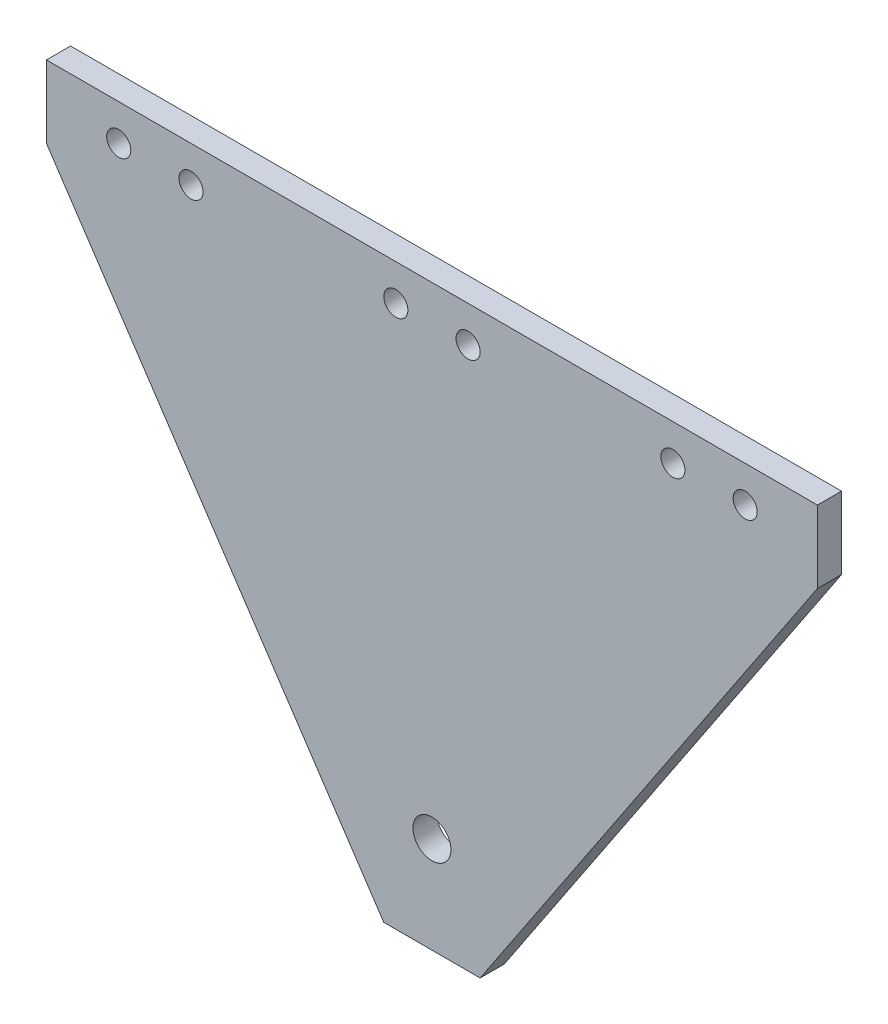
ISO-10303-21;
HEADER;
FILE_DESCRIPTION(('STEP AP214'),'2;1');
FILE_NAME('part.step','',(''),(''),'','','');
FILE_SCHEMA(('AUTOMOTIVE_DESIGN { 1 0 10303 214 1 1 1 1 }'));
ENDSEC;
DATA;
#1=APPLICATION_CONTEXT('core data for automotive mechanical design processes');
#2=APPLICATION_PROTOCOL_DEFINITION('international standard','automotive_design',2000,#1);
#3=PRODUCT_CONTEXT('',#1,'mechanical');
#4=PRODUCT('Part','Part','',(#3));
#5=PRODUCT_RELATED_PRODUCT_CATEGORY('part','',(#4));
#6=PRODUCT_DEFINITION_FORMATION('','',#4);
#7=PRODUCT_DEFINITION_CONTEXT('part definition',#1,'design');
#8=PRODUCT_DEFINITION('design','',#6,#7);
#9=PRODUCT_DEFINITION_SHAPE('','',#8);
#10=(LENGTH_UNIT() NAMED_UNIT(*) SI_UNIT(.MILLI.,.METRE.));
#11=(NAMED_UNIT(*) PLANE_ANGLE_UNIT() SI_UNIT($,.RADIAN.));
#12=(NAMED_UNIT(*) SI_UNIT($,.STERADIAN.) SOLID_ANGLE_UNIT());
#13=UNCERTAINTY_MEASURE_WITH_UNIT(LENGTH_MEASURE(1.E-05),#10,'distance_accuracy_value','');
#14=(GEOMETRIC_REPRESENTATION_CONTEXT(3) GLOBAL_UNCERTAINTY_ASSIGNED_CONTEXT((#13)) GLOBAL_UNIT_ASSIGNED_CONTEXT((#10,
#11,#12)) REPRESENTATION_CONTEXT('',''));
#15=CARTESIAN_POINT('',(0.,0.,0.));
#16=DIRECTION('',(0.,0.,1.));
#17=DIRECTION('',(1.,0.,0.));
#18=AXIS2_PLACEMENT_3D('',#15,#16,#17);
#19=CARTESIAN_POINT('',(0.,0.,3.175));
#20=DIRECTION('',(0.,0.,-1.));
#21=DIRECTION('',(-1.,0.,0.));
#22=AXIS2_PLACEMENT_3D('',#19,#20,#21);
#23=PLANE('',#22);
#24=DIRECTION('',(0.,1.,0.));
#25=VECTOR('',#24,1.);
#26=CARTESIAN_POINT('',(50.8,-4.7625,3.175));
#27=LINE('',#26,#25);
#28=CARTESIAN_POINT('',(50.8,-4.7625,3.175));
#29=VERTEX_POINT('',#28);
#30=CARTESIAN_POINT('',(50.8,4.7625,3.175));
#31=VERTEX_POINT('',#30);
#32=EDGE_CURVE('E129',#29,#31,#27,.T.);
#33=ORIENTED_EDGE('',*,*,#32,.T.);
#34=DIRECTION('',(-1.,0.,0.));
#35=VECTOR('',#34,1.);
#36=CARTESIAN_POINT('',(-50.8,4.7625,3.175));
#37=LINE('',#36,#35);
#38=CARTESIAN_POINT('',(-50.8,4.7625,3.175));
#39=VERTEX_POINT('',#38);
#40=EDGE_CURVE('E87',#31,#39,#37,.T.);
#41=ORIENTED_EDGE('',*,*,#40,.T.);
#42=DIRECTION('',(0.,-1.,0.));
#43=VECTOR('',#42,1.);
#44=CARTESIAN_POINT('',(-50.8,-4.7625,3.175));
#45=LINE('',#44,#43);
#46=CARTESIAN_POINT('',(-50.8,-4.7625,3.175));
#47=VERTEX_POINT('',#46);
#48=EDGE_CURVE('E100',#39,#47,#45,.T.);
#49=ORIENTED_EDGE('',*,*,#48,.T.);
#50=DIRECTION('',(0.554700196225229,-0.832050294337844,0.));
#51=VECTOR('',#50,1.);
#52=CARTESIAN_POINT('',(-50.8,-4.7625,3.175));
#53=LINE('',#52,#51);
#54=CARTESIAN_POINT('',(-6.34999999999999,-71.4375,3.175));
#55=VERTEX_POINT('',#54);
#56=EDGE_CURVE('E94',#47,#55,#53,.T.);
#57=ORIENTED_EDGE('',*,*,#56,.T.);
#58=DIRECTION('',(1.,0.,0.));
#59=VECTOR('',#58,1.);
#60=CARTESIAN_POINT('',(-6.34999999999999,-71.4375,3.175));
#61=LINE('',#60,#59);
#62=CARTESIAN_POINT('',(6.35000000000001,-71.4375,3.175));
#63=VERTEX_POINT('',#62);
#64=EDGE_CURVE('E98',#55,#63,#61,.T.);
#65=ORIENTED_EDGE('',*,*,#64,.T.);
#66=DIRECTION('',(0.554700196225229,0.832050294337844,0.));
#67=VECTOR('',#66,1.);
#68=CARTESIAN_POINT('',(50.8,-4.7625,3.175));
#69=LINE('',#68,#67);
#70=EDGE_CURVE('E50',#63,#29,#69,.T.);
#71=ORIENTED_EDGE('',*,*,#70,.T.);
#72=EDGE_LOOP('',(#33,#41,#49,#57,#65,#71));
#73=FACE_BOUND('',#72,.T.);
#74=CARTESIAN_POINT('',(0.,-58.7375,3.175));
#75=DIRECTION('',(0.,0.,1.));
#76=DIRECTION('',(1.,0.,0.));
#77=AXIS2_PLACEMENT_3D('',#74,#75,#76);
#78=CIRCLE('',#77,2.50000008);
#79=CARTESIAN_POINT('',(2.50000008000001,-58.7375,3.175));
#80=VERTEX_POINT('',#79);
#81=EDGE_CURVE('E122',#80,#80,#78,.T.);
#82=ORIENTED_EDGE('',*,*,#81,.F.);
#83=EDGE_LOOP('',(#82));
#84=FACE_BOUND('',#83,.T.);
#85=CARTESIAN_POINT('',(4.7625,0.,3.175));
#86=DIRECTION('',(0.,0.,1.));
#87=DIRECTION('',(1.,0.,0.));
#88=AXIS2_PLACEMENT_3D('',#85,#86,#87);
#89=CIRCLE('',#88,1.5875);
#90=CARTESIAN_POINT('',(6.35,0.,3.175));
#91=VERTEX_POINT('',#90);
#92=EDGE_CURVE('E223',#91,#91,#89,.T.);
#93=ORIENTED_EDGE('',*,*,#92,.F.);
#94=EDGE_LOOP('',(#93));
#95=FACE_BOUND('',#94,.T.);
#96=CARTESIAN_POINT('',(-4.7625,0.,3.175));
#97=DIRECTION('',(0.,0.,1.));
#98=DIRECTION('',(1.,0.,0.));
#99=AXIS2_PLACEMENT_3D('',#96,#97,#98);
#100=CIRCLE('',#99,1.5875);
#101=CARTESIAN_POINT('',(-3.175,0.,3.175));
#102=VERTEX_POINT('',#101);
#103=EDGE_CURVE('E217',#102,#102,#100,.T.);
#104=ORIENTED_EDGE('',*,*,#103,.F.);
#105=EDGE_LOOP('',(#104));
#106=FACE_BOUND('',#105,.T.);
#107=CARTESIAN_POINT('',(-41.275,0.,3.175));
#108=DIRECTION('',(0.,0.,1.));
#109=DIRECTION('',(1.,0.,0.));
#110=AXIS2_PLACEMENT_3D('',#107,#108,#109);
#111=CIRCLE('',#110,1.5875);
#112=CARTESIAN_POINT('',(-39.6875,0.,3.175));
#113=VERTEX_POINT('',#112);
#114=EDGE_CURVE('E211',#113,#113,#111,.T.);
#115=ORIENTED_EDGE('',*,*,#114,.F.);
#116=EDGE_LOOP('',(#115));
#117=FACE_BOUND('',#116,.T.);
#118=CARTESIAN_POINT('',(-31.75,0.,3.175));
#119=DIRECTION('',(0.,0.,1.));
#120=DIRECTION('',(1.,0.,0.));
#121=AXIS2_PLACEMENT_3D('',#118,#119,#120);
#122=CIRCLE('',#121,1.5875);
#123=CARTESIAN_POINT('',(-30.1625,0.,3.175));
#124=VERTEX_POINT('',#123);
#125=EDGE_CURVE('E205',#124,#124,#122,.T.);
#126=ORIENTED_EDGE('',*,*,#125,.F.);
#127=EDGE_LOOP('',(#126));
#128=FACE_BOUND('',#127,.T.);
#129=CARTESIAN_POINT('',(31.75,0.,3.175));
#130=DIRECTION('',(0.,0.,1.));
#131=DIRECTION('',(1.,0.,0.));
#132=AXIS2_PLACEMENT_3D('',#129,#130,#131);
#133=CIRCLE('',#132,1.5875);
#134=CARTESIAN_POINT('',(33.3375,0.,3.175));
#135=VERTEX_POINT('',#134);
#136=EDGE_CURVE('E199',#135,#135,#133,.T.);
#137=ORIENTED_EDGE('',*,*,#136,.F.);
#138=EDGE_LOOP('',(#137));
#139=FACE_BOUND('',#138,.T.);
#140=CARTESIAN_POINT('',(41.275,0.,3.175));
#141=DIRECTION('',(0.,0.,1.));
#142=DIRECTION('',(1.,0.,0.));
#143=AXIS2_PLACEMENT_3D('',#140,#141,#142);
#144=CIRCLE('',#143,1.5875);
#145=CARTESIAN_POINT('',(42.8625,0.,3.175));
#146=VERTEX_POINT('',#145);
#147=EDGE_CURVE('E190',#146,#146,#144,.T.);
#148=ORIENTED_EDGE('',*,*,#147,.F.);
#149=EDGE_LOOP('',(#148));
#150=FACE_BOUND('',#149,.T.);
#151=ADVANCED_FACE('F33',(#73,#84,#95,#106,#117,#128,#139,#150),#23,.F.);
#152=CARTESIAN_POINT('',(0.,0.,0.));
#153=DIRECTION('',(0.,0.,-1.));
#154=DIRECTION('',(-1.,0.,0.));
#155=AXIS2_PLACEMENT_3D('',#152,#153,#154);
#156=PLANE('',#155);
#157=CARTESIAN_POINT('',(31.75,0.,0.));
#158=DIRECTION('',(0.,0.,1.));
#159=DIRECTION('',(1.,0.,0.));
#160=AXIS2_PLACEMENT_3D('',#157,#158,#159);
#161=CIRCLE('',#160,1.5875);
#162=CARTESIAN_POINT('',(33.3375,0.,0.));
#163=VERTEX_POINT('',#162);
#164=EDGE_CURVE('E196',#163,#163,#161,.T.);
#165=ORIENTED_EDGE('',*,*,#164,.T.);
#166=EDGE_LOOP('',(#165));
#167=FACE_BOUND('',#166,.T.);
#168=CARTESIAN_POINT('',(-41.275,0.,0.));
#169=DIRECTION('',(0.,0.,1.));
#170=DIRECTION('',(1.,0.,0.));
#171=AXIS2_PLACEMENT_3D('',#168,#169,#170);
#172=CIRCLE('',#171,1.5875);
#173=CARTESIAN_POINT('',(-39.6875,0.,0.));
#174=VERTEX_POINT('',#173);
#175=EDGE_CURVE('E208',#174,#174,#172,.T.);
#176=ORIENTED_EDGE('',*,*,#175,.T.);
#177=EDGE_LOOP('',(#176));
#178=FACE_BOUND('',#177,.T.);
#179=CARTESIAN_POINT('',(4.7625,0.,0.));
#180=DIRECTION('',(0.,0.,1.));
#181=DIRECTION('',(1.,0.,0.));
#182=AXIS2_PLACEMENT_3D('',#179,#180,#181);
#183=CIRCLE('',#182,1.5875);
#184=CARTESIAN_POINT('',(6.35,0.,0.));
#185=VERTEX_POINT('',#184);
#186=EDGE_CURVE('E220',#185,#185,#183,.T.);
#187=ORIENTED_EDGE('',*,*,#186,.T.);
#188=EDGE_LOOP('',(#187));
#189=FACE_BOUND('',#188,.T.);
#190=DIRECTION('',(0.,1.,0.));
#191=VECTOR('',#190,1.);
#192=CARTESIAN_POINT('',(50.8,-4.7625,0.));
#193=LINE('',#192,#191);
#194=CARTESIAN_POINT('',(50.8,-4.7625,0.));
#195=VERTEX_POINT('',#194);
#196=CARTESIAN_POINT('',(50.8,4.7625,0.));
#197=VERTEX_POINT('',#196);
#198=EDGE_CURVE('E118',#195,#197,#193,.T.);
#199=ORIENTED_EDGE('',*,*,#198,.F.);
#200=DIRECTION('',(0.554700196225229,0.832050294337844,0.));
#201=VECTOR('',#200,1.);
#202=CARTESIAN_POINT('',(50.8,-4.7625,0.));
#203=LINE('',#202,#201);
#204=CARTESIAN_POINT('',(6.35000000000001,-71.4375,0.));
#205=VERTEX_POINT('',#204);
#206=EDGE_CURVE('E79',#205,#195,#203,.T.);
#207=ORIENTED_EDGE('',*,*,#206,.F.);
#208=DIRECTION('',(1.,0.,0.));
#209=VECTOR('',#208,1.);
#210=CARTESIAN_POINT('',(-6.34999999999999,-71.4375,0.));
#211=LINE('',#210,#209);
#212=CARTESIAN_POINT('',(-6.34999999999999,-71.4375,0.));
#213=VERTEX_POINT('',#212);
#214=EDGE_CURVE('E73',#213,#205,#211,.T.);
#215=ORIENTED_EDGE('',*,*,#214,.F.);
#216=DIRECTION('',(0.554700196225229,-0.832050294337844,0.));
#217=VECTOR('',#216,1.);
#218=CARTESIAN_POINT('',(-50.8,-4.7625,0.));
#219=LINE('',#218,#217);
#220=CARTESIAN_POINT('',(-50.8,-4.7625,0.));
#221=VERTEX_POINT('',#220);
#222=EDGE_CURVE('E108',#221,#213,#219,.T.);
#223=ORIENTED_EDGE('',*,*,#222,.F.);
#224=DIRECTION('',(0.,-1.,0.));
#225=VECTOR('',#224,1.);
#226=CARTESIAN_POINT('',(-50.8,-4.7625,0.));
#227=LINE('',#226,#225);
#228=CARTESIAN_POINT('',(-50.8,4.7625,0.));
#229=VERTEX_POINT('',#228);
#230=EDGE_CURVE('E124',#229,#221,#227,.T.);
#231=ORIENTED_EDGE('',*,*,#230,.F.);
#232=DIRECTION('',(-1.,0.,0.));
#233=VECTOR('',#232,1.);
#234=CARTESIAN_POINT('',(-50.8,4.7625,0.));
#235=LINE('',#234,#233);
#236=EDGE_CURVE('E121',#197,#229,#235,.T.);
#237=ORIENTED_EDGE('',*,*,#236,.F.);
#238=EDGE_LOOP('',(#199,#207,#215,#223,#231,#237));
#239=FACE_BOUND('',#238,.T.);
#240=CARTESIAN_POINT('',(0.,-58.7375,0.));
#241=DIRECTION('',(0.,0.,1.));
#242=DIRECTION('',(1.,0.,0.));
#243=AXIS2_PLACEMENT_3D('',#240,#241,#242);
#244=CIRCLE('',#243,2.50000008);
#245=CARTESIAN_POINT('',(2.50000008000001,-58.7375,0.));
#246=VERTEX_POINT('',#245);
#247=EDGE_CURVE('E226',#246,#246,#244,.T.);
#248=ORIENTED_EDGE('',*,*,#247,.T.);
#249=EDGE_LOOP('',(#248));
#250=FACE_BOUND('',#249,.T.);
#251=CARTESIAN_POINT('',(-4.7625,0.,0.));
#252=DIRECTION('',(0.,0.,1.));
#253=DIRECTION('',(1.,0.,0.));
#254=AXIS2_PLACEMENT_3D('',#251,#252,#253);
#255=CIRCLE('',#254,1.5875);
#256=CARTESIAN_POINT('',(-3.175,0.,0.));
#257=VERTEX_POINT('',#256);
#258=EDGE_CURVE('E214',#257,#257,#255,.T.);
#259=ORIENTED_EDGE('',*,*,#258,.T.);
#260=EDGE_LOOP('',(#259));
#261=FACE_BOUND('',#260,.T.);
#262=CARTESIAN_POINT('',(-31.75,0.,0.));
#263=DIRECTION('',(0.,0.,1.));
#264=DIRECTION('',(1.,0.,0.));
#265=AXIS2_PLACEMENT_3D('',#262,#263,#264);
#266=CIRCLE('',#265,1.5875);
#267=CARTESIAN_POINT('',(-30.1625,0.,0.));
#268=VERTEX_POINT('',#267);
#269=EDGE_CURVE('E202',#268,#268,#266,.T.);
#270=ORIENTED_EDGE('',*,*,#269,.T.);
#271=EDGE_LOOP('',(#270));
#272=FACE_BOUND('',#271,.T.);
#273=CARTESIAN_POINT('',(41.275,0.,0.));
#274=DIRECTION('',(0.,0.,1.));
#275=DIRECTION('',(1.,0.,0.));
#276=AXIS2_PLACEMENT_3D('',#273,#274,#275);
#277=CIRCLE('',#276,1.5875);
#278=CARTESIAN_POINT('',(42.8625,0.,0.));
#279=VERTEX_POINT('',#278);
#280=EDGE_CURVE('E193',#279,#279,#277,.T.);
#281=ORIENTED_EDGE('',*,*,#280,.T.);
#282=EDGE_LOOP('',(#281));
#283=FACE_BOUND('',#282,.T.);
#284=ADVANCED_FACE('F138',(#167,#178,#189,#239,#250,#261,#272,#283),#156,.T.);
#285=CARTESIAN_POINT('',(50.8,-4.7625,3.175));
#286=DIRECTION('',(-1.,0.,0.));
#287=DIRECTION('',(0.,0.,1.));
#288=AXIS2_PLACEMENT_3D('',#285,#286,#287);
#289=PLANE('',#288);
#290=ORIENTED_EDGE('',*,*,#198,.T.);
#291=DIRECTION('',(0.,0.,-1.));
#292=VECTOR('',#291,1.);
#293=CARTESIAN_POINT('',(50.8,4.7625,3.175));
#294=LINE('',#293,#292);
#295=EDGE_CURVE('E11',#31,#197,#294,.T.);
#296=ORIENTED_EDGE('',*,*,#295,.F.);
#297=ORIENTED_EDGE('',*,*,#32,.F.);
#298=DIRECTION('',(0.,0.,-1.));
#299=VECTOR('',#298,1.);
#300=CARTESIAN_POINT('',(50.8,-4.7625,3.175));
#301=LINE('',#300,#299);
#302=EDGE_CURVE('E114',#29,#195,#301,.T.);
#303=ORIENTED_EDGE('',*,*,#302,.T.);
#304=EDGE_LOOP('',(#290,#296,#297,#303));
#305=FACE_BOUND('',#304,.T.);
#306=ADVANCED_FACE('F35',(#305),#289,.F.);
#307=CARTESIAN_POINT('',(-50.8,4.7625,3.175));
#308=DIRECTION('',(0.,-1.,0.));
#309=DIRECTION('',(0.,0.,-1.));
#310=AXIS2_PLACEMENT_3D('',#307,#308,#309);
#311=PLANE('',#310);
#312=ORIENTED_EDGE('',*,*,#236,.T.);
#313=DIRECTION('',(0.,0.,-1.));
#314=VECTOR('',#313,1.);
#315=CARTESIAN_POINT('',(-50.8,4.7625,3.175));
#316=LINE('',#315,#314);
#317=EDGE_CURVE('E42',#39,#229,#316,.T.);
#318=ORIENTED_EDGE('',*,*,#317,.F.);
#319=ORIENTED_EDGE('',*,*,#40,.F.);
#320=ORIENTED_EDGE('',*,*,#295,.T.);
#321=EDGE_LOOP('',(#312,#318,#319,#320));
#322=FACE_BOUND('',#321,.T.);
#323=ADVANCED_FACE('F313',(#322),#311,.F.);
#324=CARTESIAN_POINT('',(-50.8,-4.7625,3.175));
#325=DIRECTION('',(1.,0.,0.));
#326=DIRECTION('',(0.,0.,-1.));
#327=AXIS2_PLACEMENT_3D('',#324,#325,#326);
#328=PLANE('',#327);
#329=ORIENTED_EDGE('',*,*,#230,.T.);
#330=DIRECTION('',(0.,0.,-1.));
#331=VECTOR('',#330,1.);
#332=CARTESIAN_POINT('',(-50.8,-4.7625,3.175));
#333=LINE('',#332,#331);
#334=EDGE_CURVE('E109',#47,#221,#333,.T.);
#335=ORIENTED_EDGE('',*,*,#334,.F.);
#336=ORIENTED_EDGE('',*,*,#48,.F.);
#337=ORIENTED_EDGE('',*,*,#317,.T.);
#338=EDGE_LOOP('',(#329,#335,#336,#337));
#339=FACE_BOUND('',#338,.T.);
#340=ADVANCED_FACE('F135',(#339),#328,.F.);
#341=CARTESIAN_POINT('',(-50.8,-4.7625,3.175));
#342=DIRECTION('',(0.832050294337844,0.554700196225229,0.));
#343=DIRECTION('',(-0.554700196225229,0.832050294337844,0.));
#344=AXIS2_PLACEMENT_3D('',#341,#342,#343);
#345=PLANE('',#344);
#346=ORIENTED_EDGE('',*,*,#222,.T.);
#347=DIRECTION('',(0.,0.,-1.));
#348=VECTOR('',#347,1.);
#349=CARTESIAN_POINT('',(-6.34999999999999,-71.4375,3.175));
#350=LINE('',#349,#348);
#351=EDGE_CURVE('E105',#55,#213,#350,.T.);
#352=ORIENTED_EDGE('',*,*,#351,.F.);
#353=ORIENTED_EDGE('',*,*,#56,.F.);
#354=ORIENTED_EDGE('',*,*,#334,.T.);
#355=EDGE_LOOP('',(#346,#352,#353,#354));
#356=FACE_BOUND('',#355,.T.);
#357=ADVANCED_FACE('F106',(#356),#345,.F.);
#358=CARTESIAN_POINT('',(-6.34999999999999,-71.4375,3.175));
#359=DIRECTION('',(0.,1.,0.));
#360=DIRECTION('',(0.,0.,1.));
#361=AXIS2_PLACEMENT_3D('',#358,#359,#360);
#362=PLANE('',#361);
#363=ORIENTED_EDGE('',*,*,#214,.T.);
#364=DIRECTION('',(0.,0.,-1.));
#365=VECTOR('',#364,1.);
#366=CARTESIAN_POINT('',(6.35000000000001,-71.4375,3.175));
#367=LINE('',#366,#365);
#368=EDGE_CURVE('E110',#63,#205,#367,.T.);
#369=ORIENTED_EDGE('',*,*,#368,.F.);
#370=ORIENTED_EDGE('',*,*,#64,.F.);
#371=ORIENTED_EDGE('',*,*,#351,.T.);
#372=EDGE_LOOP('',(#363,#369,#370,#371));
#373=FACE_BOUND('',#372,.T.);
#374=ADVANCED_FACE('F112',(#373),#362,.F.);
#375=CARTESIAN_POINT('',(50.8,-4.7625,3.175));
#376=DIRECTION('',(-0.832050294337844,0.554700196225229,0.));
#377=DIRECTION('',(-0.554700196225229,-0.832050294337844,0.));
#378=AXIS2_PLACEMENT_3D('',#375,#376,#377);
#379=PLANE('',#378);
#380=ORIENTED_EDGE('',*,*,#206,.T.);
#381=ORIENTED_EDGE('',*,*,#302,.F.);
#382=ORIENTED_EDGE('',*,*,#70,.F.);
#383=ORIENTED_EDGE('',*,*,#368,.T.);
#384=EDGE_LOOP('',(#380,#381,#382,#383));
#385=FACE_BOUND('',#384,.T.);
#386=ADVANCED_FACE('F143',(#385),#379,.F.);
#387=CARTESIAN_POINT('',(0.,-58.7375,3.175));
#388=DIRECTION('',(0.,0.,-1.));
#389=DIRECTION('',(-1.,0.,0.));
#390=AXIS2_PLACEMENT_3D('',#387,#388,#389);
#391=CYLINDRICAL_SURFACE('',#390,2.50000008);
#392=ORIENTED_EDGE('',*,*,#81,.T.);
#393=EDGE_LOOP('',(#392));
#394=FACE_BOUND('',#393,.T.);
#395=ORIENTED_EDGE('',*,*,#247,.F.);
#396=EDGE_LOOP('',(#395));
#397=FACE_BOUND('',#396,.T.);
#398=ADVANCED_FACE('F145',(#394,#397),#391,.F.);
#399=CARTESIAN_POINT('',(4.7625,0.,3.175));
#400=DIRECTION('',(0.,0.,-1.));
#401=DIRECTION('',(-1.,0.,0.));
#402=AXIS2_PLACEMENT_3D('',#399,#400,#401);
#403=CYLINDRICAL_SURFACE('',#402,1.5875);
#404=ORIENTED_EDGE('',*,*,#92,.T.);
#405=EDGE_LOOP('',(#404));
#406=FACE_BOUND('',#405,.T.);
#407=ORIENTED_EDGE('',*,*,#186,.F.);
#408=EDGE_LOOP('',(#407));
#409=FACE_BOUND('',#408,.T.);
#410=ADVANCED_FACE('F151',(#406,#409),#403,.F.);
#411=CARTESIAN_POINT('',(-4.7625,0.,3.175));
#412=DIRECTION('',(0.,0.,-1.));
#413=DIRECTION('',(-1.,0.,0.));
#414=AXIS2_PLACEMENT_3D('',#411,#412,#413);
#415=CYLINDRICAL_SURFACE('',#414,1.5875);
#416=ORIENTED_EDGE('',*,*,#103,.T.);
#417=EDGE_LOOP('',(#416));
#418=FACE_BOUND('',#417,.T.);
#419=ORIENTED_EDGE('',*,*,#258,.F.);
#420=EDGE_LOOP('',(#419));
#421=FACE_BOUND('',#420,.T.);
#422=ADVANCED_FACE('F165',(#418,#421),#415,.F.);
#423=CARTESIAN_POINT('',(-41.275,0.,3.175));
#424=DIRECTION('',(0.,0.,-1.));
#425=DIRECTION('',(-1.,0.,0.));
#426=AXIS2_PLACEMENT_3D('',#423,#424,#425);
#427=CYLINDRICAL_SURFACE('',#426,1.5875);
#428=ORIENTED_EDGE('',*,*,#114,.T.);
#429=EDGE_LOOP('',(#428));
#430=FACE_BOUND('',#429,.T.);
#431=ORIENTED_EDGE('',*,*,#175,.F.);
#432=EDGE_LOOP('',(#431));
#433=FACE_BOUND('',#432,.T.);
#434=ADVANCED_FACE('F169',(#430,#433),#427,.F.);
#435=CARTESIAN_POINT('',(-31.75,0.,3.175));
#436=DIRECTION('',(0.,0.,-1.));
#437=DIRECTION('',(-1.,0.,0.));
#438=AXIS2_PLACEMENT_3D('',#435,#436,#437);
#439=CYLINDRICAL_SURFACE('',#438,1.5875);
#440=ORIENTED_EDGE('',*,*,#125,.T.);
#441=EDGE_LOOP('',(#440));
#442=FACE_BOUND('',#441,.T.);
#443=ORIENTED_EDGE('',*,*,#269,.F.);
#444=EDGE_LOOP('',(#443));
#445=FACE_BOUND('',#444,.T.);
#446=ADVANCED_FACE('F173',(#442,#445),#439,.F.);
#447=CARTESIAN_POINT('',(31.75,0.,3.175));
#448=DIRECTION('',(0.,0.,-1.));
#449=DIRECTION('',(-1.,0.,0.));
#450=AXIS2_PLACEMENT_3D('',#447,#448,#449);
#451=CYLINDRICAL_SURFACE('',#450,1.5875);
#452=ORIENTED_EDGE('',*,*,#136,.T.);
#453=EDGE_LOOP('',(#452));
#454=FACE_BOUND('',#453,.T.);
#455=ORIENTED_EDGE('',*,*,#164,.F.);
#456=EDGE_LOOP('',(#455));
#457=FACE_BOUND('',#456,.T.);
#458=ADVANCED_FACE('F177',(#454,#457),#451,.F.);
#459=CARTESIAN_POINT('',(41.275,0.,3.175));
#460=DIRECTION('',(0.,0.,-1.));
#461=DIRECTION('',(-1.,0.,0.));
#462=AXIS2_PLACEMENT_3D('',#459,#460,#461);
#463=CYLINDRICAL_SURFACE('',#462,1.5875);
#464=ORIENTED_EDGE('',*,*,#147,.T.);
#465=EDGE_LOOP('',(#464));
#466=FACE_BOUND('',#465,.T.);
#467=ORIENTED_EDGE('',*,*,#280,.F.);
#468=EDGE_LOOP('',(#467));
#469=FACE_BOUND('',#468,.T.);
#470=ADVANCED_FACE('F181',(#466,#469),#463,.F.);
#471=CLOSED_SHELL('',(#151,#284,#306,#323,#340,#357,#374,#386,#398,#410,#422,#434,#446,#458,#470));
#472=MANIFOLD_SOLID_BREP('B2',#471);
#473=ADVANCED_BREP_SHAPE_REPRESENTATION('',(#18,#472),#14);
#474=SHAPE_DEFINITION_REPRESENTATION(#9,#473);
ENDSEC;
END-ISO-10303-21;
